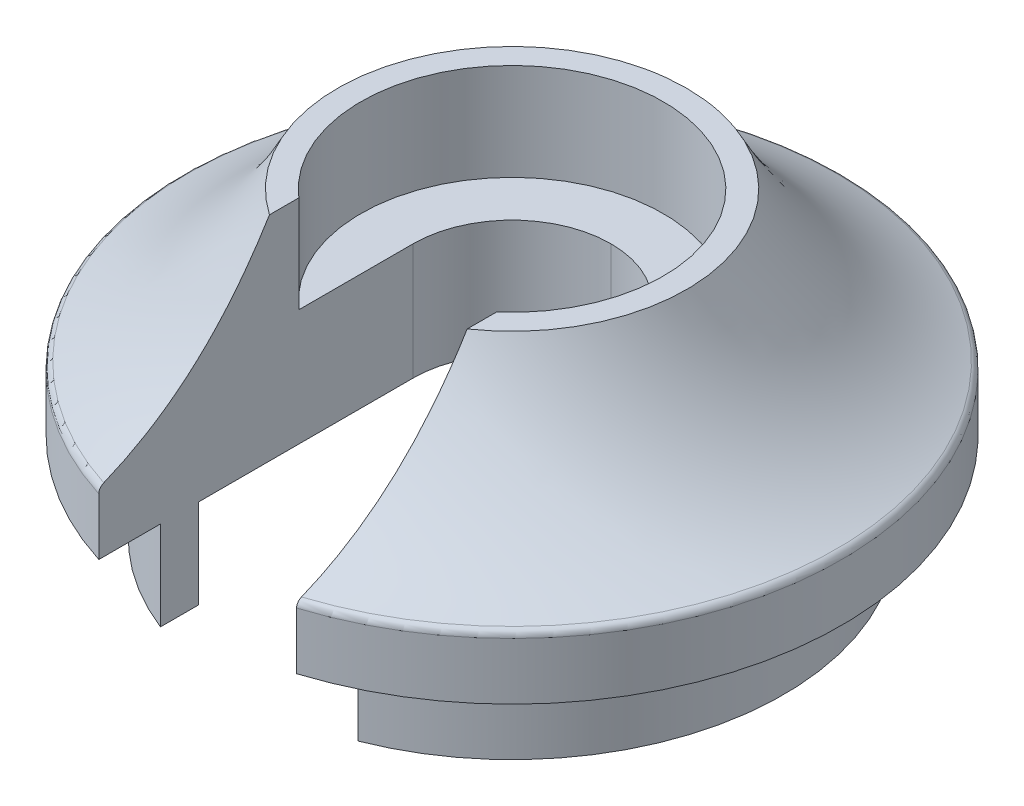
ISO-10303-21;
HEADER;
FILE_DESCRIPTION(('STEP AP214'),'2;1');
FILE_NAME('part.step','',(''),(''),'','','');
FILE_SCHEMA(('AUTOMOTIVE_DESIGN { 1 0 10303 214 1 1 1 1 }'));
ENDSEC;
DATA;
#1=APPLICATION_CONTEXT('core data for automotive mechanical design processes');
#2=APPLICATION_PROTOCOL_DEFINITION('international standard','automotive_design',2000,#1);
#3=PRODUCT_CONTEXT('',#1,'mechanical');
#4=PRODUCT('Part','Part','',(#3));
#5=PRODUCT_RELATED_PRODUCT_CATEGORY('part','',(#4));
#6=PRODUCT_DEFINITION_FORMATION('','',#4);
#7=PRODUCT_DEFINITION_CONTEXT('part definition',#1,'design');
#8=PRODUCT_DEFINITION('design','',#6,#7);
#9=PRODUCT_DEFINITION_SHAPE('','',#8);
#10=(LENGTH_UNIT() NAMED_UNIT(*) SI_UNIT(.MILLI.,.METRE.));
#11=(NAMED_UNIT(*) PLANE_ANGLE_UNIT() SI_UNIT($,.RADIAN.));
#12=(NAMED_UNIT(*) SI_UNIT($,.STERADIAN.) SOLID_ANGLE_UNIT());
#13=UNCERTAINTY_MEASURE_WITH_UNIT(LENGTH_MEASURE(1.E-05),#10,'distance_accuracy_value','');
#14=(GEOMETRIC_REPRESENTATION_CONTEXT(3) GLOBAL_UNCERTAINTY_ASSIGNED_CONTEXT((#13)) GLOBAL_UNIT_ASSIGNED_CONTEXT((#10,
#11,#12)) REPRESENTATION_CONTEXT('',''));
#15=CARTESIAN_POINT('',(0.,0.,0.));
#16=DIRECTION('',(0.,0.,1.));
#17=DIRECTION('',(1.,0.,0.));
#18=AXIS2_PLACEMENT_3D('',#15,#16,#17);
#19=CARTESIAN_POINT('',(0.,10.,0.));
#20=DIRECTION('',(0.,-1.,0.));
#21=DIRECTION('',(0.,0.,-1.));
#22=AXIS2_PLACEMENT_3D('',#19,#20,#21);
#23=CYLINDRICAL_SURFACE('',#22,2.55);
#24=CARTESIAN_POINT('',(0.,5.3,0.));
#25=DIRECTION('',(0.,-1.,0.));
#26=DIRECTION('',(0.,0.,1.));
#27=AXIS2_PLACEMENT_3D('',#24,#25,#26);
#28=CIRCLE('',#27,2.55);
#29=CARTESIAN_POINT('',(0.,5.3,-2.55));
#30=VERTEX_POINT('',#29);
#31=CARTESIAN_POINT('',(2.55,5.3,0.));
#32=VERTEX_POINT('',#31);
#33=EDGE_CURVE('E42',#30,#32,#28,.T.);
#34=ORIENTED_EDGE('',*,*,#33,.F.);
#35=DIRECTION('',(0.,-1.,0.));
#36=VECTOR('',#35,1.);
#37=CARTESIAN_POINT('',(0.,10.,-2.55));
#38=LINE('',#37,#36);
#39=CARTESIAN_POINT('',(0.,2.3,-2.55));
#40=VERTEX_POINT('',#39);
#41=EDGE_CURVE('E11',#30,#40,#38,.T.);
#42=ORIENTED_EDGE('',*,*,#41,.T.);
#43=CARTESIAN_POINT('',(0.,2.3,0.));
#44=DIRECTION('',(0.,-1.,0.));
#45=DIRECTION('',(0.,0.,1.));
#46=AXIS2_PLACEMENT_3D('',#43,#44,#45);
#47=CIRCLE('',#46,2.55);
#48=CARTESIAN_POINT('',(2.55,2.3,0.));
#49=VERTEX_POINT('',#48);
#50=EDGE_CURVE('E28',#40,#49,#47,.T.);
#51=ORIENTED_EDGE('',*,*,#50,.T.);
#52=DIRECTION('',(0.,-1.,0.));
#53=VECTOR('',#52,1.);
#54=CARTESIAN_POINT('',(2.55,10.,0.));
#55=LINE('',#54,#53);
#56=EDGE_CURVE('E371',#32,#49,#55,.T.);
#57=ORIENTED_EDGE('',*,*,#56,.F.);
#58=EDGE_LOOP('',(#34,#42,#51,#57));
#59=FACE_BOUND('',#58,.T.);
#60=ADVANCED_FACE('F17',(#59),#23,.F.);
#61=CARTESIAN_POINT('',(0.,3.76648141199396,0.));
#62=DIRECTION('',(0.,-1.,0.));
#63=DIRECTION('',(0.,0.,-1.));
#64=AXIS2_PLACEMENT_3D('',#61,#62,#63);
#65=TOROIDAL_SURFACE('',#64,8.3,0.2);
#66=CARTESIAN_POINT('',(0.,3.95048873132015,0.));
#67=DIRECTION('',(0.,1.,0.));
#68=DIRECTION('',(0.,0.,1.));
#69=AXIS2_PLACEMENT_3D('',#66,#67,#68);
#70=CIRCLE('',#69,8.37836648795495);
#71=CARTESIAN_POINT('',(0.,3.95048873132015,-8.37836648795495));
#72=VERTEX_POINT('',#71);
#73=CARTESIAN_POINT('',(-2.55,3.9504887313201,7.98088497639757));
#74=VERTEX_POINT('',#73);
#75=EDGE_CURVE('E186',#72,#74,#70,.T.);
#76=ORIENTED_EDGE('',*,*,#75,.F.);
#77=CARTESIAN_POINT('',(0.,3.76648141199396,-8.3));
#78=DIRECTION('',(-1.,0.,0.));
#79=DIRECTION('',(0.,0.,1.));
#80=AXIS2_PLACEMENT_3D('',#77,#78,#79);
#81=CIRCLE('',#80,0.2);
#82=CARTESIAN_POINT('',(0.,3.76648141199396,-8.5));
#83=VERTEX_POINT('',#82);
#84=EDGE_CURVE('E412',#72,#83,#81,.T.);
#85=ORIENTED_EDGE('',*,*,#84,.T.);
#86=CARTESIAN_POINT('',(0.,3.76648141199396,0.));
#87=DIRECTION('',(0.,-1.,0.));
#88=DIRECTION('',(0.,0.,-1.));
#89=AXIS2_PLACEMENT_3D('',#86,#87,#88);
#90=CIRCLE('',#89,8.5);
#91=CARTESIAN_POINT('',(-2.55,3.76648141199271,8.10848321205248));
#92=VERTEX_POINT('',#91);
#93=EDGE_CURVE('E298',#92,#83,#90,.T.);
#94=ORIENTED_EDGE('',*,*,#93,.F.);
#95=CARTESIAN_POINT('',(-2.5499999999976,3.76648141199271,8.10848321204479));
#96=CARTESIAN_POINT('',(-2.55000000730326,3.76864469260102,8.10848323037497));
#97=CARTESIAN_POINT('',(-2.55000162864751,3.77080796463198,8.10844590762757));
#98=CARTESIAN_POINT('',(-2.55000758283459,3.77514967595081,8.10829628774533));
#99=CARTESIAN_POINT('',(-2.55001193780528,3.77732809413225,8.10818337825862));
#100=CARTESIAN_POINT('',(-2.55002286986745,3.78169769982166,8.10788105361864));
#101=CARTESIAN_POINT('',(-2.55002946502801,3.7838888440519,8.10769101383329));
#102=CARTESIAN_POINT('',(-2.55004441618053,3.78828140344149,8.10723299194817));
#103=CARTESIAN_POINT('',(-2.55005278637327,3.7904827522647,8.10696437419797));
#104=CARTESIAN_POINT('',(-2.5500708422647,3.79489311377526,8.10634782558007));
#105=CARTESIAN_POINT('',(-2.55008053839736,3.79710203615184,8.10599924907134));
#106=CARTESIAN_POINT('',(-2.55010082231853,3.8015248325889,8.10522149339372));
#107=CARTESIAN_POINT('',(-2.55011141693237,3.80373859151682,8.1047916597511));
#108=CARTESIAN_POINT('',(-2.55013309622184,3.80816824452674,8.10385018506626));
#109=CARTESIAN_POINT('',(-2.55014418428844,3.81038399785329,8.10333788190323));
#110=CARTESIAN_POINT('',(-2.55016647325908,3.8148147207209,8.1022303551063));
#111=CARTESIAN_POINT('',(-2.55017767432039,3.8170295231386,8.10163446294283));
#112=CARTESIAN_POINT('',(-2.55019983822372,3.82145532489506,8.10035874278918));
#113=CARTESIAN_POINT('',(-2.55021079821264,3.82366613005444,8.09967824114175));
#114=CARTESIAN_POINT('',(-2.55023215700721,3.82808082012186,8.09823239071388));
#115=CARTESIAN_POINT('',(-2.55024255019548,3.83028448316653,8.09746636447176));
#116=CARTESIAN_POINT('',(-2.55026248244525,3.83468167678026,8.09584866389885));
#117=CARTESIAN_POINT('',(-2.55027201339278,3.83687495723661,8.09499630966413));
#118=CARTESIAN_POINT('',(-2.55028996019706,3.84124808160976,8.09320526883457));
#119=CARTESIAN_POINT('',(-2.55029836573181,3.84342764666423,8.09226590129204));
#120=CARTESIAN_POINT('',(-2.55031383470304,3.84776994793238,8.09030027258506));
#121=CARTESIAN_POINT('',(-2.55032088591796,3.84993237610126,8.08927333086099));
#122=CARTESIAN_POINT('',(-2.55033345519132,3.85423692706396,8.08713212184322));
#123=CARTESIAN_POINT('',(-2.55033895945605,3.85637871226742,8.08601717584021));
#124=CARTESIAN_POINT('',(-2.55034828172296,3.86063842094722,8.08369966189236));
#125=CARTESIAN_POINT('',(-2.55035208470464,3.86275597699636,8.08249641857806));
#126=CARTESIAN_POINT('',(-2.55035789125913,3.86696359603276,8.0800021554089));
#127=CARTESIAN_POINT('',(-2.55035987894689,3.86905326153852,8.07871046503804));
#128=CARTESIAN_POINT('',(-2.55036198373361,3.87320139843314,8.0760393010425));
#129=CARTESIAN_POINT('',(-2.55036208446102,3.87525944214445,8.07465916328969));
#130=CARTESIAN_POINT('',(-2.55036038811295,3.87934057037161,8.07181125170537));
#131=CARTESIAN_POINT('',(-2.55035857457218,3.88136319694949,8.07034282168548));
#132=CARTESIAN_POINT('',(-2.55035306842546,3.88536966794423,8.06731863250034));
#133=CARTESIAN_POINT('',(-2.55034935966676,3.88735302417737,8.06576222665228));
#134=CARTESIAN_POINT('',(-2.55034012973902,3.89127708021085,8.06256255821391));
#135=CARTESIAN_POINT('',(-2.55033459314843,3.89321726167683,8.0609186600226));
#136=CARTESIAN_POINT('',(-2.55032182406672,3.89705104962643,8.05754465029803));
#137=CARTESIAN_POINT('',(-2.55031457731504,3.8989441078018,8.05581391582861));
#138=CARTESIAN_POINT('',(-2.55029855617842,3.90267969382078,8.05226705326181));
#139=CARTESIAN_POINT('',(-2.5502897691336,3.9045216436418,8.05045031647914));
#140=CARTESIAN_POINT('',(-2.5502708892948,3.90815102873001,8.04673245039141));
#141=CARTESIAN_POINT('',(-2.55026078588997,3.90993785660355,8.04483072823724));
#142=CARTESIAN_POINT('',(-2.55023955064024,3.91345299307992,8.04094407871478));
#143=CARTESIAN_POINT('',(-2.55022841068922,3.91518066534581,8.03895857591429));
#144=CARTESIAN_POINT('',(-2.55020543682832,3.91857347421187,8.03490574312472));
#145=CARTESIAN_POINT('',(-2.55019359777876,3.92023794604462,8.03283785669256));
#146=CARTESIAN_POINT('',(-2.55016961905669,3.92350033525584,8.0286218295738));
#147=CARTESIAN_POINT('',(-2.55015747767737,3.92509756003479,8.02647315299298));
#148=CARTESIAN_POINT('',(-2.55013334807405,3.92822144357688,8.02209731724631));
#149=CARTESIAN_POINT('',(-2.5501213620458,3.92974738259178,8.01986964427826));
#150=CARTESIAN_POINT('',(-2.55009805892869,3.93272470069336,8.01533778963586));
#151=CARTESIAN_POINT('',(-2.55008674841018,3.93417533365462,8.01303311777425));
#152=CARTESIAN_POINT('',(-2.55006537532866,3.93699807280933,8.00834944436116));
#153=CARTESIAN_POINT('',(-2.55005532418165,3.93836940734758,8.00596997773478));
#154=CARTESIAN_POINT('',(-2.55003711411605,3.94102962506739,8.00113910191081));
#155=CARTESIAN_POINT('',(-2.55002897193544,3.94231771203236,7.99868725422261));
#156=CARTESIAN_POINT('',(-2.55001528781431,3.94480754761605,7.99371421214809));
#157=CARTESIAN_POINT('',(-2.55000976838488,3.94600847637416,7.99119260728232));
#158=CARTESIAN_POINT('',(-2.55000211281541,3.94832021829637,7.98608286254511));
#159=CARTESIAN_POINT('',(-2.55000000549345,3.94943018946667,7.98349434164155));
#160=CARTESIAN_POINT('',(-2.54999999999999,3.9504887313201,7.98088497639757));
#161=B_SPLINE_CURVE_WITH_KNOTS('',3,(#95,#96,#97,#98,#99,#100,#101,#102,#103,#104,#105,#106,
#107,#108,#109,#110,#111,#112,#113,#114,#115,#116,#117,#118,#119,#120,#121,#122,#123,#124,#125,
#126,#127,#128,#129,#130,#131,#132,#133,#134,#135,#136,#137,#138,#139,#140,#141,#142,#143,#144,
#145,#146,#147,#148,#149,#150,#151,#152,#153,#154,#155,#156,#157,#158,#159,#160),.UNSPECIFIED.,
.F.,.F.,(4,2,2,2,2,2,2,2,2,2,2,2,2,2,2,2,2,2,2,2,2,2,2,2,2,2,2,2,2,2,2,2,4),(0.,
0.00648950798332805,0.0130322361696587,0.0196290422504767,0.0262807624634979,0.032988211700674,
0.0397521836298338,0.0465734508292739,0.0534527649347166,0.0603908567981627,0.0673884366582495,
0.0744461943218448,0.0815647993566676,0.0887449012948437,0.0959871298473562,0.103292095129443,
0.110660387897061,0.118092579794568,0.125589223613888,0.133150853565391,0.140777985560837,
0.148471117508704,0.156230729622274,0.164057284740869,0.17195122866462,0.179912990503167,
0.187942983038674,0.196041603103526,0.204209231973076,0.212446235773759,0.220752965906833,
0.229129759488037,0.237576939803324),.UNSPECIFIED.);
#162=EDGE_CURVE('E271',#92,#74,#161,.T.);
#163=ORIENTED_EDGE('',*,*,#162,.T.);
#164=EDGE_LOOP('',(#76,#85,#94,#163));
#165=FACE_BOUND('',#164,.T.);
#166=ADVANCED_FACE('F219',(#165),#65,.T.);
#167=CARTESIAN_POINT('',(0.,3.9,0.));
#168=DIRECTION('',(0.,-1.,0.));
#169=DIRECTION('',(0.,0.,-1.));
#170=AXIS2_PLACEMENT_3D('',#167,#168,#169);
#171=CYLINDRICAL_SURFACE('',#170,8.5);
#172=ORIENTED_EDGE('',*,*,#93,.T.);
#173=DIRECTION('',(0.,-1.,0.));
#174=VECTOR('',#173,1.);
#175=CARTESIAN_POINT('',(0.,3.9,-8.5));
#176=LINE('',#175,#174);
#177=CARTESIAN_POINT('',(0.,2.3,-8.5));
#178=VERTEX_POINT('',#177);
#179=EDGE_CURVE('E302',#83,#178,#176,.T.);
#180=ORIENTED_EDGE('',*,*,#179,.T.);
#181=CARTESIAN_POINT('',(0.,2.3,0.));
#182=DIRECTION('',(0.,1.,0.));
#183=DIRECTION('',(0.,0.,1.));
#184=AXIS2_PLACEMENT_3D('',#181,#182,#183);
#185=CIRCLE('',#184,8.5);
#186=CARTESIAN_POINT('',(-2.55,2.3,8.10848321204404));
#187=VERTEX_POINT('',#186);
#188=EDGE_CURVE('E397',#178,#187,#185,.T.);
#189=ORIENTED_EDGE('',*,*,#188,.T.);
#190=DIRECTION('',(0.,-1.,0.));
#191=VECTOR('',#190,1.);
#192=CARTESIAN_POINT('',(-2.55,3.9,8.10848321204404));
#193=LINE('',#192,#191);
#194=EDGE_CURVE('E291',#92,#187,#193,.T.);
#195=ORIENTED_EDGE('',*,*,#194,.F.);
#196=EDGE_LOOP('',(#172,#180,#189,#195));
#197=FACE_BOUND('',#196,.T.);
#198=ADVANCED_FACE('F224',(#197),#171,.T.);
#199=CARTESIAN_POINT('',(0.,2.3,0.));
#200=DIRECTION('',(0.,-1.,0.));
#201=DIRECTION('',(0.,0.,-1.));
#202=AXIS2_PLACEMENT_3D('',#199,#200,#201);
#203=CYLINDRICAL_SURFACE('',#202,6.1);
#204=CARTESIAN_POINT('',(0.,2.3,0.));
#205=DIRECTION('',(0.,1.,0.));
#206=DIRECTION('',(0.,0.,1.));
#207=AXIS2_PLACEMENT_3D('',#204,#205,#206);
#208=CIRCLE('',#207,6.1);
#209=CARTESIAN_POINT('',(2.55,2.3,5.54143483224336));
#210=VERTEX_POINT('',#209);
#211=CARTESIAN_POINT('',(0.,2.3,-6.1));
#212=VERTEX_POINT('',#211);
#213=EDGE_CURVE('E393',#210,#212,#208,.T.);
#214=ORIENTED_EDGE('',*,*,#213,.T.);
#215=DIRECTION('',(0.,-1.,0.));
#216=VECTOR('',#215,1.);
#217=CARTESIAN_POINT('',(0.,2.3,-6.1));
#218=LINE('',#217,#216);
#219=CARTESIAN_POINT('',(0.,0.,-6.1));
#220=VERTEX_POINT('',#219);
#221=EDGE_CURVE('E398',#212,#220,#218,.T.);
#222=ORIENTED_EDGE('',*,*,#221,.T.);
#223=CARTESIAN_POINT('',(0.,0.,0.));
#224=DIRECTION('',(0.,1.,0.));
#225=DIRECTION('',(0.,0.,1.));
#226=AXIS2_PLACEMENT_3D('',#223,#224,#225);
#227=CIRCLE('',#226,6.1);
#228=CARTESIAN_POINT('',(2.55,0.,5.54143483224336));
#229=VERTEX_POINT('',#228);
#230=EDGE_CURVE('E375',#229,#220,#227,.T.);
#231=ORIENTED_EDGE('',*,*,#230,.F.);
#232=DIRECTION('',(0.,1.,0.));
#233=VECTOR('',#232,1.);
#234=CARTESIAN_POINT('',(2.55,2.3,5.54143483224336));
#235=LINE('',#234,#233);
#236=EDGE_CURVE('E391',#229,#210,#235,.T.);
#237=ORIENTED_EDGE('',*,*,#236,.T.);
#238=EDGE_LOOP('',(#214,#222,#231,#237));
#239=FACE_BOUND('',#238,.T.);
#240=ADVANCED_FACE('F236',(#239),#203,.F.);
#241=CARTESIAN_POINT('',(0.,2.3,0.));
#242=DIRECTION('',(0.,-1.,0.));
#243=DIRECTION('',(0.,0.,-1.));
#244=AXIS2_PLACEMENT_3D('',#241,#242,#243);
#245=CYLINDRICAL_SURFACE('',#244,7.);
#246=CARTESIAN_POINT('',(0.,2.3,0.));
#247=DIRECTION('',(0.,1.,0.));
#248=DIRECTION('',(0.,0.,1.));
#249=AXIS2_PLACEMENT_3D('',#246,#247,#248);
#250=CIRCLE('',#249,7.);
#251=CARTESIAN_POINT('',(0.,2.3,-7.));
#252=VERTEX_POINT('',#251);
#253=CARTESIAN_POINT('',(-2.55,2.3,6.51901066113563));
#254=VERTEX_POINT('',#253);
#255=EDGE_CURVE('E185',#252,#254,#250,.T.);
#256=ORIENTED_EDGE('',*,*,#255,.F.);
#257=DIRECTION('',(0.,-1.,0.));
#258=VECTOR('',#257,1.);
#259=CARTESIAN_POINT('',(0.,2.3,-7.));
#260=LINE('',#259,#258);
#261=CARTESIAN_POINT('',(0.,0.,-7.));
#262=VERTEX_POINT('',#261);
#263=EDGE_CURVE('E387',#252,#262,#260,.T.);
#264=ORIENTED_EDGE('',*,*,#263,.T.);
#265=CARTESIAN_POINT('',(0.,0.,0.));
#266=DIRECTION('',(0.,1.,0.));
#267=DIRECTION('',(0.,0.,1.));
#268=AXIS2_PLACEMENT_3D('',#265,#266,#267);
#269=CIRCLE('',#268,7.);
#270=CARTESIAN_POINT('',(-2.55,0.,6.51901066113563));
#271=VERTEX_POINT('',#270);
#272=EDGE_CURVE('E392',#262,#271,#269,.T.);
#273=ORIENTED_EDGE('',*,*,#272,.T.);
#274=DIRECTION('',(0.,-1.,0.));
#275=VECTOR('',#274,1.);
#276=CARTESIAN_POINT('',(-2.55,2.3,6.51901066113563));
#277=LINE('',#276,#275);
#278=EDGE_CURVE('E447',#254,#271,#277,.T.);
#279=ORIENTED_EDGE('',*,*,#278,.F.);
#280=EDGE_LOOP('',(#256,#264,#273,#279));
#281=FACE_BOUND('',#280,.T.);
#282=ADVANCED_FACE('F327',(#281),#245,.T.);
#283=CARTESIAN_POINT('',(0.,0.,0.));
#284=DIRECTION('',(0.,1.,0.));
#285=DIRECTION('',(1.,0.,0.));
#286=AXIS2_PLACEMENT_3D('',#283,#284,#285);
#287=PLANE('',#286);
#288=DIRECTION('',(0.,0.,1.));
#289=VECTOR('',#288,1.);
#290=CARTESIAN_POINT('',(-2.55,0.,0.));
#291=LINE('',#290,#289);
#292=CARTESIAN_POINT('',(-2.55,0.,5.54143483224336));
#293=VERTEX_POINT('',#292);
#294=EDGE_CURVE('E462',#293,#271,#291,.T.);
#295=ORIENTED_EDGE('',*,*,#294,.T.);
#296=ORIENTED_EDGE('',*,*,#272,.F.);
#297=CARTESIAN_POINT('',(0.,0.,0.));
#298=DIRECTION('',(0.,1.,0.));
#299=DIRECTION('',(0.,0.,1.));
#300=AXIS2_PLACEMENT_3D('',#297,#298,#299);
#301=CIRCLE('',#300,7.);
#302=CARTESIAN_POINT('',(2.55,0.,6.51901066113563));
#303=VERTEX_POINT('',#302);
#304=EDGE_CURVE('E376',#303,#262,#301,.T.);
#305=ORIENTED_EDGE('',*,*,#304,.F.);
#306=DIRECTION('',(0.,0.,-1.));
#307=VECTOR('',#306,1.);
#308=CARTESIAN_POINT('',(2.55,0.,11.3377187851519));
#309=LINE('',#308,#307);
#310=EDGE_CURVE('E463',#303,#229,#309,.T.);
#311=ORIENTED_EDGE('',*,*,#310,.T.);
#312=ORIENTED_EDGE('',*,*,#230,.T.);
#313=CARTESIAN_POINT('',(0.,0.,0.));
#314=DIRECTION('',(0.,1.,0.));
#315=DIRECTION('',(0.,0.,1.));
#316=AXIS2_PLACEMENT_3D('',#313,#314,#315);
#317=CIRCLE('',#316,6.1);
#318=EDGE_CURVE('E372',#220,#293,#317,.T.);
#319=ORIENTED_EDGE('',*,*,#318,.T.);
#320=EDGE_LOOP('',(#295,#296,#305,#311,#312,#319));
#321=FACE_BOUND('',#320,.T.);
#322=ADVANCED_FACE('F324',(#321),#287,.F.);
#323=CARTESIAN_POINT('',(0.,2.3,0.));
#324=DIRECTION('',(0.,-1.,0.));
#325=DIRECTION('',(0.,0.,-1.));
#326=AXIS2_PLACEMENT_3D('',#323,#324,#325);
#327=CYLINDRICAL_SURFACE('',#326,7.);
#328=ORIENTED_EDGE('',*,*,#263,.F.);
#329=CARTESIAN_POINT('',(0.,2.3,0.));
#330=DIRECTION('',(0.,1.,0.));
#331=DIRECTION('',(0.,0.,1.));
#332=AXIS2_PLACEMENT_3D('',#329,#330,#331);
#333=CIRCLE('',#332,7.);
#334=CARTESIAN_POINT('',(2.55,2.3,6.51901066113563));
#335=VERTEX_POINT('',#334);
#336=EDGE_CURVE('E386',#335,#252,#333,.T.);
#337=ORIENTED_EDGE('',*,*,#336,.F.);
#338=DIRECTION('',(0.,1.,0.));
#339=VECTOR('',#338,1.);
#340=CARTESIAN_POINT('',(2.55,2.3,6.51901066113563));
#341=LINE('',#340,#339);
#342=EDGE_CURVE('E451',#303,#335,#341,.T.);
#343=ORIENTED_EDGE('',*,*,#342,.F.);
#344=ORIENTED_EDGE('',*,*,#304,.T.);
#345=EDGE_LOOP('',(#328,#337,#343,#344));
#346=FACE_BOUND('',#345,.T.);
#347=ADVANCED_FACE('F323',(#346),#327,.T.);
#348=CARTESIAN_POINT('',(0.,2.3,0.));
#349=DIRECTION('',(0.,-1.,0.));
#350=DIRECTION('',(0.,0.,-1.));
#351=AXIS2_PLACEMENT_3D('',#348,#349,#350);
#352=CYLINDRICAL_SURFACE('',#351,6.1);
#353=ORIENTED_EDGE('',*,*,#221,.F.);
#354=CARTESIAN_POINT('',(0.,2.3,0.));
#355=DIRECTION('',(0.,1.,0.));
#356=DIRECTION('',(0.,0.,1.));
#357=AXIS2_PLACEMENT_3D('',#354,#355,#356);
#358=CIRCLE('',#357,6.1);
#359=CARTESIAN_POINT('',(-2.55,2.3,5.54143483224336));
#360=VERTEX_POINT('',#359);
#361=EDGE_CURVE('E354',#212,#360,#358,.T.);
#362=ORIENTED_EDGE('',*,*,#361,.T.);
#363=DIRECTION('',(0.,-1.,0.));
#364=VECTOR('',#363,1.);
#365=CARTESIAN_POINT('',(-2.55,2.3,5.54143483224336));
#366=LINE('',#365,#364);
#367=EDGE_CURVE('E402',#360,#293,#366,.T.);
#368=ORIENTED_EDGE('',*,*,#367,.T.);
#369=ORIENTED_EDGE('',*,*,#318,.F.);
#370=EDGE_LOOP('',(#353,#362,#368,#369));
#371=FACE_BOUND('',#370,.T.);
#372=ADVANCED_FACE('F339',(#371),#352,.F.);
#373=CARTESIAN_POINT('',(0.,2.3,0.));
#374=DIRECTION('',(0.,1.,0.));
#375=DIRECTION('',(1.,0.,0.));
#376=AXIS2_PLACEMENT_3D('',#373,#374,#375);
#377=PLANE('',#376);
#378=DIRECTION('',(0.,0.,-1.));
#379=VECTOR('',#378,1.);
#380=CARTESIAN_POINT('',(-2.55,2.3,0.));
#381=LINE('',#380,#379);
#382=CARTESIAN_POINT('',(-2.55,2.3,0.));
#383=VERTEX_POINT('',#382);
#384=EDGE_CURVE('E350',#360,#383,#381,.T.);
#385=ORIENTED_EDGE('',*,*,#384,.F.);
#386=ORIENTED_EDGE('',*,*,#361,.F.);
#387=ORIENTED_EDGE('',*,*,#213,.F.);
#388=DIRECTION('',(0.,0.,1.));
#389=VECTOR('',#388,1.);
#390=CARTESIAN_POINT('',(2.55,2.3,0.));
#391=LINE('',#390,#389);
#392=EDGE_CURVE('E467',#49,#210,#391,.T.);
#393=ORIENTED_EDGE('',*,*,#392,.F.);
#394=ORIENTED_EDGE('',*,*,#50,.F.);
#395=CARTESIAN_POINT('',(0.,2.3,0.));
#396=DIRECTION('',(0.,-1.,0.));
#397=DIRECTION('',(0.,0.,1.));
#398=AXIS2_PLACEMENT_3D('',#395,#396,#397);
#399=CIRCLE('',#398,2.55);
#400=EDGE_CURVE('E356',#383,#40,#399,.T.);
#401=ORIENTED_EDGE('',*,*,#400,.F.);
#402=EDGE_LOOP('',(#385,#386,#387,#393,#394,#401));
#403=FACE_BOUND('',#402,.T.);
#404=ADVANCED_FACE('F337',(#403),#377,.F.);
#405=CARTESIAN_POINT('',(0.,3.9,0.));
#406=DIRECTION('',(0.,-1.,0.));
#407=DIRECTION('',(0.,0.,-1.));
#408=AXIS2_PLACEMENT_3D('',#405,#406,#407);
#409=CYLINDRICAL_SURFACE('',#408,8.5);
#410=ORIENTED_EDGE('',*,*,#179,.F.);
#411=CARTESIAN_POINT('',(0.,3.76648141199396,0.));
#412=DIRECTION('',(0.,-1.,0.));
#413=DIRECTION('',(0.,0.,-1.));
#414=AXIS2_PLACEMENT_3D('',#411,#412,#413);
#415=CIRCLE('',#414,8.5);
#416=CARTESIAN_POINT('',(2.55,3.76648141199396,8.10848321204404));
#417=VERTEX_POINT('',#416);
#418=EDGE_CURVE('E385',#83,#417,#415,.T.);
#419=ORIENTED_EDGE('',*,*,#418,.T.);
#420=DIRECTION('',(0.,1.,0.));
#421=VECTOR('',#420,1.);
#422=CARTESIAN_POINT('',(2.55,3.9,8.10848321204404));
#423=LINE('',#422,#421);
#424=CARTESIAN_POINT('',(2.55,2.3,8.10848321204404));
#425=VERTEX_POINT('',#424);
#426=EDGE_CURVE('E370',#425,#417,#423,.T.);
#427=ORIENTED_EDGE('',*,*,#426,.F.);
#428=CARTESIAN_POINT('',(0.,2.3,0.));
#429=DIRECTION('',(0.,1.,0.));
#430=DIRECTION('',(0.,0.,1.));
#431=AXIS2_PLACEMENT_3D('',#428,#429,#430);
#432=CIRCLE('',#431,8.5);
#433=EDGE_CURVE('E381',#425,#178,#432,.T.);
#434=ORIENTED_EDGE('',*,*,#433,.T.);
#435=EDGE_LOOP('',(#410,#419,#427,#434));
#436=FACE_BOUND('',#435,.T.);
#437=ADVANCED_FACE('F19',(#436),#409,.T.);
#438=CARTESIAN_POINT('',(0.,2.3,0.));
#439=DIRECTION('',(0.,1.,0.));
#440=DIRECTION('',(1.,0.,0.));
#441=AXIS2_PLACEMENT_3D('',#438,#439,#440);
#442=PLANE('',#441);
#443=DIRECTION('',(0.,0.,-1.));
#444=VECTOR('',#443,1.);
#445=CARTESIAN_POINT('',(-2.55,2.3,0.));
#446=LINE('',#445,#444);
#447=EDGE_CURVE('E295',#187,#254,#446,.T.);
#448=ORIENTED_EDGE('',*,*,#447,.F.);
#449=ORIENTED_EDGE('',*,*,#188,.F.);
#450=ORIENTED_EDGE('',*,*,#433,.F.);
#451=DIRECTION('',(0.,0.,1.));
#452=VECTOR('',#451,1.);
#453=CARTESIAN_POINT('',(2.55,2.3,0.));
#454=LINE('',#453,#452);
#455=EDGE_CURVE('E455',#335,#425,#454,.T.);
#456=ORIENTED_EDGE('',*,*,#455,.F.);
#457=ORIENTED_EDGE('',*,*,#336,.T.);
#458=ORIENTED_EDGE('',*,*,#255,.T.);
#459=EDGE_LOOP('',(#448,#449,#450,#456,#457,#458));
#460=FACE_BOUND('',#459,.T.);
#461=ADVANCED_FACE('F235',(#460),#442,.F.);
#462=CARTESIAN_POINT('',(1.22314586074443,7.8,4.33057896860729));
#463=CARTESIAN_POINT('',(7.95510922584044,7.8,2.42917659622463));
#464=CARTESIAN_POINT('',(6.99533142393533,7.8,-4.50000000000002));
#465=CARTESIAN_POINT('',(0.,7.8,-4.5));
#466=CARTESIAN_POINT('',(-6.99533142393534,7.8,-4.49999999999998));
#467=CARTESIAN_POINT('',(-7.95510922584042,7.8,2.42917659622466));
#468=CARTESIAN_POINT('',(-1.22314586074441,7.8,4.3305789686073));
#469=CARTESIAN_POINT('',(1.60470222218137,5.00439351653812,5.68148895179723));
#470=CARTESIAN_POINT('',(10.4366795997922,5.00439351653812,3.18695031160074));
#471=CARTESIAN_POINT('',(9.17750224331555,5.00439351653812,-5.90376032129253));
#472=CARTESIAN_POINT('',(0.,5.00439351653812,-5.9037603212925));
#473=CARTESIAN_POINT('',(-9.17750224331557,5.00439351653812,-5.90376032129249));
#474=CARTESIAN_POINT('',(-10.4366795997921,5.00439351653812,3.18695031160079));
#475=CARTESIAN_POINT('',(-1.60470222218134,5.00439351653812,5.68148895179723));
#476=CARTESIAN_POINT('',(2.27732539767599,3.95048873132015,8.06292837867152));
#477=CARTESIAN_POINT('',(14.8112934546228,3.95048873132015,4.52278484158509));
#478=CARTESIAN_POINT('',(13.0243223054307,3.95048873132015,-8.37836648795498));
#479=CARTESIAN_POINT('',(0.,3.95048873132015,-8.37836648795495));
#480=CARTESIAN_POINT('',(-13.0243223054307,3.95048873132015,-8.37836648795491));
#481=CARTESIAN_POINT('',(-14.8112934546228,3.95048873132014,4.52278484158516));
#482=CARTESIAN_POINT('',(-2.27732539767595,3.95048873132014,8.06292837867153));
#483=(BOUNDED_SURFACE() B_SPLINE_SURFACE(2,3,((#462,#463,#464,#465,#466,#467,#468),(#469,#470,
#471,#472,#473,#474,#475),(#476,#477,#478,#479,#480,#481,#482)),.UNSPECIFIED.,.F.,.F.,
.F.) B_SPLINE_SURFACE_WITH_KNOTS((3,3),(4,3,4),(0.,0.853327571810689),(0.,0.5,1.),
.UNSPECIFIED.) GEOMETRIC_REPRESENTATION_ITEM() RATIONAL_B_SPLINE_SURFACE(((1.,0.424801746930923,
0.424801746930923,1.,0.424801746930923,0.424801746930923,1.),(1.,0.424801746930923,
0.424801746930923,1.,0.424801746930923,0.424801746930923,1.),(1.,0.424801746930923,
0.424801746930923,1.,0.424801746930923,0.424801746930923,1.))) REPRESENTATION_ITEM('') SURFACE());
#484=CARTESIAN_POINT('',(0.,3.95048873132015,0.));
#485=DIRECTION('',(0.,1.,0.));
#486=DIRECTION('',(0.,0.,1.));
#487=AXIS2_PLACEMENT_3D('',#484,#485,#486);
#488=CIRCLE('',#487,8.37836648795495);
#489=CARTESIAN_POINT('',(2.55,3.95048873132015,7.98088497639745));
#490=VERTEX_POINT('',#489);
#491=EDGE_CURVE('E183',#490,#72,#488,.T.);
#492=CARTESIAN_POINT('',(-2.55000000000001,3.95048873132014,7.98088497639745));
#493=CARTESIAN_POINT('',(-2.5500006167357,3.99804024097785,7.8636429286815));
#494=CARTESIAN_POINT('',(-2.55001017789206,4.04841020129753,7.74754201810113));
#495=CARTESIAN_POINT('',(-2.55003630036181,4.15391539230899,7.51959277859792));
#496=CARTESIAN_POINT('',(-2.55005275686954,4.20896982865084,7.40770704378399));
#497=CARTESIAN_POINT('',(-2.55008223819433,4.32365940043246,7.18807070815166));
#498=CARTESIAN_POINT('',(-2.55009530302528,4.3832292871694,7.08028603914383));
#499=CARTESIAN_POINT('',(-2.55011278953167,4.50675295418504,6.86872842235609));
#500=CARTESIAN_POINT('',(-2.55011729781931,4.57065594721561,6.764925809836));
#501=CARTESIAN_POINT('',(-2.55011623309044,4.70265657773249,6.5612092210369));
#502=CARTESIAN_POINT('',(-2.55011074094827,4.77071630100335,6.46127066525032));
#503=CARTESIAN_POINT('',(-2.55009184365701,4.91084386255172,6.26515803158373));
#504=CARTESIAN_POINT('',(-2.55007848655594,4.98288497673179,6.16896484515817));
#505=CARTESIAN_POINT('',(-2.55004980676015,5.1307927733706,5.98021821924956));
#506=CARTESIAN_POINT('',(-2.55003449252962,5.20664217499547,5.88765122635931));
#507=CARTESIAN_POINT('',(-2.55000920279794,5.36198837073783,5.70603207313181));
#508=CARTESIAN_POINT('',(-2.54999921409905,5.44147561314671,5.61697173522052));
#509=CARTESIAN_POINT('',(-2.55000077197135,5.60255925846221,5.44370434499106));
#510=CARTESIAN_POINT('',(-2.55001193998204,5.68409330678892,5.35943924988984));
#511=CARTESIAN_POINT('',(-2.55004304071185,5.85106133983196,5.19337424538445));
#512=CARTESIAN_POINT('',(-2.5500630494884,5.93652327035114,5.11160245969857));
#513=CARTESIAN_POINT('',(-2.55009911454969,6.1112940079741,4.95047205815008));
#514=CARTESIAN_POINT('',(-2.55011512885278,6.20063296048053,4.87114617586528));
#515=CARTESIAN_POINT('',(-2.55013698306756,6.38310563503449,4.71485320433244));
#516=CARTESIAN_POINT('',(-2.55014270594659,6.47627083318132,4.63792290533527));
#517=CARTESIAN_POINT('',(-2.55014196916265,6.66634489683893,4.48636501873632));
#518=CARTESIAN_POINT('',(-2.55013535796179,6.76328581147899,4.4117776750757));
#519=CARTESIAN_POINT('',(-2.55011257177546,6.96086149132278,4.26484717664213));
#520=CARTESIAN_POINT('',(-2.55009627072424,7.06152824123857,4.19254707994182));
#521=CARTESIAN_POINT('',(-2.55006073539124,7.26650516551427,4.05013064387258));
#522=CARTESIAN_POINT('',(-2.55004146294971,7.37084671224228,3.98005954121954));
#523=CARTESIAN_POINT('',(-2.55001126444541,7.583128922672,3.84203518401196));
#524=CARTESIAN_POINT('',(-2.55000046624325,7.69110000477226,3.77412867500026));
#525=CARTESIAN_POINT('',(-2.55000000000001,7.8,3.70776212829248));
#526=B_SPLINE_CURVE_WITH_KNOTS('',3,(#492,#493,#494,#495,#496,#497,#498,#499,#500,#501,#502,
#503,#504,#505,#506,#507,#508,#509,#510,#511,#512,#513,#514,#515,#516,#517,#518,#519,#520,#521,
#522,#523,#524,#525),.UNSPECIFIED.,.F.,.F.,(4,2,2,2,2,2,2,2,2,2,2,2,2,2,2,2,4),(0.,
0.379520592076948,0.75347071331235,1.12278493077338,1.48834046380681,1.85095283714147,
2.21137261805467,2.57028330271385,2.92830035082373,3.27997178248017,3.63472942062689,
3.99307177091692,4.35546397389627,4.72233791421263,5.09409271863829,5.47109558122605,
5.8536828532207),.UNSPECIFIED.);
#527=CARTESIAN_POINT('',(-2.55,7.8,3.70776212829248));
#528=VERTEX_POINT('',#527);
#529=EDGE_CURVE('E139',#74,#528,#526,.T.);
#530=CARTESIAN_POINT('',(0.,7.8,0.));
#531=DIRECTION('',(0.,1.,0.));
#532=DIRECTION('',(0.,0.,1.));
#533=AXIS2_PLACEMENT_3D('',#530,#531,#532);
#534=CIRCLE('',#533,4.5);
#535=CARTESIAN_POINT('',(2.55,7.8,3.70776212829248));
#536=VERTEX_POINT('',#535);
#537=EDGE_CURVE('E131',#536,#528,#534,.T.);
#538=CARTESIAN_POINT('',(2.55000000000001,7.8,3.70776212829248));
#539=CARTESIAN_POINT('',(2.55000046836938,7.69079856043925,3.77431238569133));
#540=CARTESIAN_POINT('',(2.55001144621256,7.58253110455896,3.842411107414));
#541=CARTESIAN_POINT('',(2.55004218902105,7.36967350914647,3.98083461894369));
#542=CARTESIAN_POINT('',(2.55006182331294,7.26505275674402,4.05111237307743));
#543=CARTESIAN_POINT('',(2.55009810214169,7.0595355522399,4.19395761328466));
#544=CARTESIAN_POINT('',(2.55011478450338,6.9586075259102,4.26647958811957));
#545=CARTESIAN_POINT('',(2.55013822455608,6.76052825584197,4.41387003976495));
#546=CARTESIAN_POINT('',(2.5501451096708,6.6633448239608,4.48869520947416));
#547=CARTESIAN_POINT('',(2.55014619658081,6.47280550208008,4.64074560762879));
#548=CARTESIAN_POINT('',(2.55014055220683,6.37941736701379,4.71793037819266));
#549=CARTESIAN_POINT('',(2.5501186037722,6.19651940726152,4.87474978259803));
#550=CARTESIAN_POINT('',(2.55010241939247,6.10697792908032,4.95434745681745));
#551=CARTESIAN_POINT('',(2.55006578125349,5.93182353981668,5.11603950950221));
#552=CARTESIAN_POINT('',(2.55004537171943,5.84618033775405,5.19810103861049));
#553=CARTESIAN_POINT('',(2.55001320690037,5.67887194213224,5.36476422725163));
#554=CARTESIAN_POINT('',(2.55000137814269,5.59717870460427,5.44933770755342));
#555=CARTESIAN_POINT('',(2.54999860500724,5.43626472308466,5.62274380234421));
#556=CARTESIAN_POINT('',(2.55000791774467,5.35708642199953,5.71161584889876));
#557=CARTESIAN_POINT('',(2.55003211209324,5.20233763408851,5.89284273314299));
#558=CARTESIAN_POINT('',(2.55004700784474,5.12677686225564,5.98520587421799));
#559=CARTESIAN_POINT('',(2.55007507192687,4.97942492521438,6.17352837731228));
#560=CARTESIAN_POINT('',(2.55008823264456,4.90765115124088,6.26950135852312));
#561=CARTESIAN_POINT('',(2.55010698895868,4.76803587860961,6.46515647039599));
#562=CARTESIAN_POINT('',(2.55011253775438,4.70022113949063,6.56485770948195));
#563=CARTESIAN_POINT('',(2.55011392686198,4.56868711923944,6.76808187068528));
#564=CARTESIAN_POINT('',(2.55010968773929,4.50500568967678,6.87162930408516));
#565=CARTESIAN_POINT('',(2.55009287022999,4.38190084010557,7.08265810018164));
#566=CARTESIAN_POINT('',(2.5500802064135,4.32252802356751,7.19016899377215));
#567=CARTESIAN_POINT('',(2.55005152801083,4.20820729904114,7.40923863460131));
#568=CARTESIAN_POINT('',(2.55003547334751,4.15332431316099,7.52083125786369));
#569=CARTESIAN_POINT('',(2.55000996348657,4.04813591246285,7.74817450134191));
#570=CARTESIAN_POINT('',(2.5500006100933,3.99791080730528,7.86396229019772));
#571=CARTESIAN_POINT('',(2.55000000000004,3.95048873132015,7.98088497639745));
#572=B_SPLINE_CURVE_WITH_KNOTS('',3,(#538,#539,#540,#541,#542,#543,#544,#545,#546,#547,#548,
#549,#550,#551,#552,#553,#554,#555,#556,#557,#558,#559,#560,#561,#562,#563,#564,#565,#566,#567,
#568,#569,#570,#571),.UNSPECIFIED.,.F.,.F.,(4,2,2,2,2,2,2,2,2,2,2,2,2,2,2,2,4),(0.,
0.383646346309832,0.761689712366491,1.13446887177638,1.50235388222271,1.86574719759513,
2.22508451021568,2.58083525926988,2.93350274226673,3.29048218229899,3.64837193856834,
4.00778317977494,4.36939444886048,4.73395070550515,5.10226123766611,5.47519644158341,
5.85368353432607),.UNSPECIFIED.);
#573=EDGE_CURVE('E135',#536,#490,#572,.T.);
#574=ORIENTED_EDGE('',*,*,#491,.T.);
#575=ORIENTED_EDGE('',*,*,#75,.T.);
#576=ORIENTED_EDGE('',*,*,#529,.T.);
#577=ORIENTED_EDGE('',*,*,#537,.F.);
#578=ORIENTED_EDGE('',*,*,#573,.T.);
#579=EDGE_LOOP('',(#574,#575,#576,#577,#578));
#580=FACE_BOUND('',#579,.T.);
#581=ADVANCED_FACE('F134',(#580),#483,.T.);
#582=CARTESIAN_POINT('',(0.,5.3,0.));
#583=DIRECTION('',(0.,1.,0.));
#584=DIRECTION('',(1.,0.,0.));
#585=AXIS2_PLACEMENT_3D('',#582,#583,#584);
#586=PLANE('',#585);
#587=CARTESIAN_POINT('',(0.,5.3,0.));
#588=DIRECTION('',(0.,1.,0.));
#589=DIRECTION('',(0.,0.,1.));
#590=AXIS2_PLACEMENT_3D('',#587,#588,#589);
#591=CIRCLE('',#590,3.9);
#592=CARTESIAN_POINT('',(2.55,5.3,2.9508473359359));
#593=VERTEX_POINT('',#592);
#594=CARTESIAN_POINT('',(-2.55,5.3,2.9508473359359));
#595=VERTEX_POINT('',#594);
#596=EDGE_CURVE('E161',#593,#595,#591,.T.);
#597=ORIENTED_EDGE('',*,*,#596,.T.);
#598=DIRECTION('',(0.,0.,-1.));
#599=VECTOR('',#598,1.);
#600=CARTESIAN_POINT('',(-2.55,5.3,0.));
#601=LINE('',#600,#599);
#602=CARTESIAN_POINT('',(-2.55,5.3,0.));
#603=VERTEX_POINT('',#602);
#604=EDGE_CURVE('E406',#595,#603,#601,.T.);
#605=ORIENTED_EDGE('',*,*,#604,.T.);
#606=CARTESIAN_POINT('',(0.,5.3,0.));
#607=DIRECTION('',(0.,-1.,0.));
#608=DIRECTION('',(0.,0.,1.));
#609=AXIS2_PLACEMENT_3D('',#606,#607,#608);
#610=CIRCLE('',#609,2.55);
#611=EDGE_CURVE('E379',#603,#30,#610,.T.);
#612=ORIENTED_EDGE('',*,*,#611,.T.);
#613=ORIENTED_EDGE('',*,*,#33,.T.);
#614=DIRECTION('',(0.,0.,1.));
#615=VECTOR('',#614,1.);
#616=CARTESIAN_POINT('',(2.55,5.3,0.));
#617=LINE('',#616,#615);
#618=EDGE_CURVE('E380',#32,#593,#617,.T.);
#619=ORIENTED_EDGE('',*,*,#618,.T.);
#620=EDGE_LOOP('',(#597,#605,#612,#613,#619));
#621=FACE_BOUND('',#620,.T.);
#622=ADVANCED_FACE('F215',(#621),#586,.T.);
#623=CARTESIAN_POINT('',(0.,5.3,0.));
#624=DIRECTION('',(0.,1.,0.));
#625=DIRECTION('',(0.,0.,1.));
#626=AXIS2_PLACEMENT_3D('',#623,#624,#625);
#627=CYLINDRICAL_SURFACE('',#626,3.9);
#628=DIRECTION('',(0.,1.,0.));
#629=VECTOR('',#628,1.);
#630=CARTESIAN_POINT('',(-2.55,5.3,2.9508473359359));
#631=LINE('',#630,#629);
#632=CARTESIAN_POINT('',(-2.55,7.8,2.9508473359359));
#633=VERTEX_POINT('',#632);
#634=EDGE_CURVE('E294',#595,#633,#631,.T.);
#635=ORIENTED_EDGE('',*,*,#634,.F.);
#636=ORIENTED_EDGE('',*,*,#596,.F.);
#637=DIRECTION('',(0.,-1.,0.));
#638=VECTOR('',#637,1.);
#639=CARTESIAN_POINT('',(2.55,5.3,2.9508473359359));
#640=LINE('',#639,#638);
#641=CARTESIAN_POINT('',(2.55,7.8,2.9508473359359));
#642=VERTEX_POINT('',#641);
#643=EDGE_CURVE('E368',#642,#593,#640,.T.);
#644=ORIENTED_EDGE('',*,*,#643,.F.);
#645=CARTESIAN_POINT('',(0.,7.8,0.));
#646=DIRECTION('',(0.,1.,0.));
#647=DIRECTION('',(0.,0.,1.));
#648=AXIS2_PLACEMENT_3D('',#645,#646,#647);
#649=CIRCLE('',#648,3.9);
#650=EDGE_CURVE('E146',#642,#633,#649,.T.);
#651=ORIENTED_EDGE('',*,*,#650,.T.);
#652=EDGE_LOOP('',(#635,#636,#644,#651));
#653=FACE_BOUND('',#652,.T.);
#654=ADVANCED_FACE('F210',(#653),#627,.F.);
#655=CARTESIAN_POINT('',(0.,7.8,0.));
#656=DIRECTION('',(0.,1.,0.));
#657=DIRECTION('',(1.,0.,0.));
#658=AXIS2_PLACEMENT_3D('',#655,#656,#657);
#659=PLANE('',#658);
#660=ORIENTED_EDGE('',*,*,#537,.T.);
#661=DIRECTION('',(0.,0.,-1.));
#662=VECTOR('',#661,1.);
#663=CARTESIAN_POINT('',(-2.55,7.8,0.));
#664=LINE('',#663,#662);
#665=EDGE_CURVE('E147',#528,#633,#664,.T.);
#666=ORIENTED_EDGE('',*,*,#665,.T.);
#667=ORIENTED_EDGE('',*,*,#650,.F.);
#668=DIRECTION('',(0.,0.,1.));
#669=VECTOR('',#668,1.);
#670=CARTESIAN_POINT('',(2.55,7.8,0.));
#671=LINE('',#670,#669);
#672=EDGE_CURVE('E156',#642,#536,#671,.T.);
#673=ORIENTED_EDGE('',*,*,#672,.T.);
#674=EDGE_LOOP('',(#660,#666,#667,#673));
#675=FACE_BOUND('',#674,.T.);
#676=ADVANCED_FACE('F165',(#675),#659,.T.);
#677=CARTESIAN_POINT('',(0.,3.76648141199396,0.));
#678=DIRECTION('',(0.,-1.,0.));
#679=DIRECTION('',(0.,0.,-1.));
#680=AXIS2_PLACEMENT_3D('',#677,#678,#679);
#681=TOROIDAL_SURFACE('',#680,8.3,0.2);
#682=ORIENTED_EDGE('',*,*,#84,.F.);
#683=ORIENTED_EDGE('',*,*,#491,.F.);
#684=CARTESIAN_POINT('',(2.55000000000001,3.95048873132015,7.98088497639744));
#685=CARTESIAN_POINT('',(2.55000000549346,3.94943018946678,7.98349434164126));
#686=CARTESIAN_POINT('',(2.55000211281542,3.94832021829656,7.98608286254466));
#687=CARTESIAN_POINT('',(2.5500097683849,3.9460084763745,7.99119260728157));
#688=CARTESIAN_POINT('',(2.55001528781434,3.94480754761648,7.9937142121472));
#689=CARTESIAN_POINT('',(2.55002897193548,3.94231771203295,7.99868725422144));
#690=CARTESIAN_POINT('',(2.5500371141161,3.94102962506808,8.00113910190952));
#691=CARTESIAN_POINT('',(2.55005532418171,3.93836940734844,8.00596997773324));
#692=CARTESIAN_POINT('',(2.55006537532874,3.93699807281028,8.00834944435951));
#693=CARTESIAN_POINT('',(2.55008674841029,3.93417533365576,8.01303311777238));
#694=CARTESIAN_POINT('',(2.5500980589288,3.93272470069459,8.01533778963389));
#695=CARTESIAN_POINT('',(2.55012136204595,3.9297473825932,8.01986964427611));
#696=CARTESIAN_POINT('',(2.55013334807423,3.92822144357839,8.02209731724406));
#697=CARTESIAN_POINT('',(2.55015747767758,3.9250975600365,8.02647315299058));
#698=CARTESIAN_POINT('',(2.55016961905692,3.92350033525764,8.02862182957133));
#699=CARTESIAN_POINT('',(2.55019359777903,3.92023794604661,8.03283785668996));
#700=CARTESIAN_POINT('',(2.55020543682862,3.91857347421395,8.03490574312206));
#701=CARTESIAN_POINT('',(2.55022841068956,3.91518066534808,8.03895857591153));
#702=CARTESIAN_POINT('',(2.5502395506406,3.91345299308228,8.04094407871198));
#703=CARTESIAN_POINT('',(2.55026078589039,3.9099378566061,8.04483072823436));
#704=CARTESIAN_POINT('',(2.55027088929525,3.90815102873264,8.04673245038849));
#705=CARTESIAN_POINT('',(2.55028976913411,3.9045216436446,8.05045031647617));
#706=CARTESIAN_POINT('',(2.55029855617895,3.90267969382367,8.05226705325882));
#707=CARTESIAN_POINT('',(2.55031457731564,3.89894410780485,8.0558139158256));
#708=CARTESIAN_POINT('',(2.55032182406735,3.89705104962955,8.05754465029501));
#709=CARTESIAN_POINT('',(2.55033459314912,3.89321726168009,8.06091866001957));
#710=CARTESIAN_POINT('',(2.55034012973975,3.89127708021419,8.06256255821088));
#711=CARTESIAN_POINT('',(2.55034935966756,3.88735302418084,8.06576222664927));
#712=CARTESIAN_POINT('',(2.5503530684263,3.88536966794776,8.06731863249734));
#713=CARTESIAN_POINT('',(2.55035857457309,3.88136319695314,8.07034282168251));
#714=CARTESIAN_POINT('',(2.5503603881139,3.87934057037531,8.07181125170242));
#715=CARTESIAN_POINT('',(2.55036208446203,3.87525944214825,8.07465916328679));
#716=CARTESIAN_POINT('',(2.55036198373466,3.87320139843699,8.07603930103962));
#717=CARTESIAN_POINT('',(2.55035987894802,3.86905326154244,8.07871046503523));
#718=CARTESIAN_POINT('',(2.5503578912603,3.86696359603672,8.08000215540612));
#719=CARTESIAN_POINT('',(2.55035208470588,3.86275597700037,8.08249641857535));
#720=CARTESIAN_POINT('',(2.55034828172424,3.86063842095126,8.0836996618897));
#721=CARTESIAN_POINT('',(2.5503389594574,3.85637871227149,8.08601717583763));
#722=CARTESIAN_POINT('',(2.55033345519271,3.85423692706805,8.08713212184069));
#723=CARTESIAN_POINT('',(2.55032088591943,3.84993237610536,8.08927333085856));
#724=CARTESIAN_POINT('',(2.55031383470455,3.84776994793647,8.09030027258267));
#725=CARTESIAN_POINT('',(2.55029836573339,3.84342764666832,8.09226590128976));
#726=CARTESIAN_POINT('',(2.55028996019867,3.84124808161384,8.09320526883234));
#727=CARTESIAN_POINT('',(2.55027201339446,3.83687495724065,8.094996309662));
#728=CARTESIAN_POINT('',(2.55026248244696,3.83468167678428,8.09584866389678));
#729=CARTESIAN_POINT('',(2.55024255019727,3.83028448317049,8.0974663644698));
#730=CARTESIAN_POINT('',(2.55023215700903,3.82808082012578,8.09823239071198));
#731=CARTESIAN_POINT('',(2.55021079821453,3.82366613005828,8.09967824113996));
#732=CARTESIAN_POINT('',(2.55019983822564,3.82145532489885,8.10035874278744));
#733=CARTESIAN_POINT('',(2.55017767432238,3.81702952314228,8.1016344629412));
#734=CARTESIAN_POINT('',(2.55016647326109,3.81481472072452,8.10223035510472));
#735=CARTESIAN_POINT('',(2.5501441842905,3.81038399785677,8.10333788190176));
#736=CARTESIAN_POINT('',(2.55013309622393,3.80816824453015,8.10385018506484));
#737=CARTESIAN_POINT('',(2.55011141693451,3.80373859152007,8.10479165974978));
#738=CARTESIAN_POINT('',(2.5501008223207,3.80152483259207,8.10522149339245));
#739=CARTESIAN_POINT('',(2.55008053839958,3.79710203615482,8.10599924907016));
#740=CARTESIAN_POINT('',(2.55007084226694,3.79489311377815,8.10634782557893));
#741=CARTESIAN_POINT('',(2.55005278637555,3.79048275226738,8.10696437419691));
#742=CARTESIAN_POINT('',(2.55004441618282,3.78828140344406,8.10723299194716));
#743=CARTESIAN_POINT('',(2.55002946503033,3.78388884405424,8.10769101383235));
#744=CARTESIAN_POINT('',(2.55002286986979,3.78169769982387,8.10788105361773));
#745=CARTESIAN_POINT('',(2.55001193780765,3.77732809413421,8.10818337825776));
#746=CARTESIAN_POINT('',(2.55000758283697,3.77514967595264,8.1082962877445));
#747=CARTESIAN_POINT('',(2.5500016286499,3.77080796463353,8.10844590762679));
#748=CARTESIAN_POINT('',(2.55000000730566,3.76864469260242,8.1084832303742));
#749=CARTESIAN_POINT('',(2.55000000000001,3.76648141199396,8.10848321204404));
#750=B_SPLINE_CURVE_WITH_KNOTS('',3,(#684,#685,#686,#687,#688,#689,#690,#691,#692,#693,#694,
#695,#696,#697,#698,#699,#700,#701,#702,#703,#704,#705,#706,#707,#708,#709,#710,#711,#712,#713,
#714,#715,#716,#717,#718,#719,#720,#721,#722,#723,#724,#725,#726,#727,#728,#729,#730,#731,#732,
#733,#734,#735,#736,#737,#738,#739,#740,#741,#742,#743,#744,#745,#746,#747,#748,#749),
.UNSPECIFIED.,.F.,.F.,(4,2,2,2,2,2,2,2,2,2,2,2,2,2,2,2,2,2,2,2,2,2,2,2,2,2,2,2,2,2,2,2,4),(0.,
0.00844718031476453,0.0168239738954692,0.0251307040280805,0.0333677078283282,0.0415353366974754,
0.0496339567619511,0.0576639492971158,0.0656257111353519,0.0735196550588245,0.0813462101771687,
0.0891058222905203,0.0967989542381987,0.104426086233488,0.111987716184866,0.119484360004092,
0.126916551901535,0.13428484466912,0.141589809951207,0.14883203850375,0.156012140441988,
0.163130745476905,0.170188503140625,0.177186083000868,0.1841241748645,0.191003488970161,
0.19782475616985,0.204588728099289,0.211296177336776,0.21794789755014,0.22454470363133,
0.231087431818064,0.237576939801825),.UNSPECIFIED.);
#751=EDGE_CURVE('E158',#490,#417,#750,.T.);
#752=ORIENTED_EDGE('',*,*,#751,.T.);
#753=ORIENTED_EDGE('',*,*,#418,.F.);
#754=EDGE_LOOP('',(#682,#683,#752,#753));
#755=FACE_BOUND('',#754,.T.);
#756=ADVANCED_FACE('F196',(#755),#681,.T.);
#757=CARTESIAN_POINT('',(0.,10.,0.));
#758=DIRECTION('',(0.,-1.,0.));
#759=DIRECTION('',(0.,0.,-1.));
#760=AXIS2_PLACEMENT_3D('',#757,#758,#759);
#761=CYLINDRICAL_SURFACE('',#760,2.55);
#762=ORIENTED_EDGE('',*,*,#41,.F.);
#763=ORIENTED_EDGE('',*,*,#611,.F.);
#764=DIRECTION('',(0.,-1.,0.));
#765=VECTOR('',#764,1.);
#766=CARTESIAN_POINT('',(-2.55,10.,0.));
#767=LINE('',#766,#765);
#768=EDGE_CURVE('E176',#603,#383,#767,.T.);
#769=ORIENTED_EDGE('',*,*,#768,.T.);
#770=ORIENTED_EDGE('',*,*,#400,.T.);
#771=EDGE_LOOP('',(#762,#763,#769,#770));
#772=FACE_BOUND('',#771,.T.);
#773=ADVANCED_FACE('F205',(#772),#761,.F.);
#774=CARTESIAN_POINT('',(-2.55,10.,0.));
#775=DIRECTION('',(1.,0.,0.));
#776=DIRECTION('',(0.,1.,0.));
#777=AXIS2_PLACEMENT_3D('',#774,#775,#776);
#778=PLANE('',#777);
#779=ORIENTED_EDGE('',*,*,#384,.T.);
#780=ORIENTED_EDGE('',*,*,#768,.F.);
#781=ORIENTED_EDGE('',*,*,#604,.F.);
#782=ORIENTED_EDGE('',*,*,#634,.T.);
#783=ORIENTED_EDGE('',*,*,#665,.F.);
#784=ORIENTED_EDGE('',*,*,#529,.F.);
#785=ORIENTED_EDGE('',*,*,#162,.F.);
#786=ORIENTED_EDGE('',*,*,#194,.T.);
#787=ORIENTED_EDGE('',*,*,#447,.T.);
#788=ORIENTED_EDGE('',*,*,#278,.T.);
#789=ORIENTED_EDGE('',*,*,#294,.F.);
#790=ORIENTED_EDGE('',*,*,#367,.F.);
#791=EDGE_LOOP('',(#779,#780,#781,#782,#783,#784,#785,#786,#787,#788,#789,#790));
#792=FACE_BOUND('',#791,.T.);
#793=ADVANCED_FACE('F206',(#792),#778,.T.);
#794=CARTESIAN_POINT('',(2.55,10.,11.3377187851519));
#795=DIRECTION('',(-1.,0.,0.));
#796=DIRECTION('',(0.,0.,1.));
#797=AXIS2_PLACEMENT_3D('',#794,#795,#796);
#798=PLANE('',#797);
#799=ORIENTED_EDGE('',*,*,#310,.F.);
#800=ORIENTED_EDGE('',*,*,#342,.T.);
#801=ORIENTED_EDGE('',*,*,#455,.T.);
#802=ORIENTED_EDGE('',*,*,#426,.T.);
#803=ORIENTED_EDGE('',*,*,#751,.F.);
#804=ORIENTED_EDGE('',*,*,#573,.F.);
#805=ORIENTED_EDGE('',*,*,#672,.F.);
#806=ORIENTED_EDGE('',*,*,#643,.T.);
#807=ORIENTED_EDGE('',*,*,#618,.F.);
#808=ORIENTED_EDGE('',*,*,#56,.T.);
#809=ORIENTED_EDGE('',*,*,#392,.T.);
#810=ORIENTED_EDGE('',*,*,#236,.F.);
#811=EDGE_LOOP('',(#799,#800,#801,#802,#803,#804,#805,#806,#807,#808,#809,#810));
#812=FACE_BOUND('',#811,.T.);
#813=ADVANCED_FACE('F154',(#812),#798,.T.);
#814=CLOSED_SHELL('',(#60,#166,#198,#240,#282,#322,#347,#372,#404,#437,#461,#581,#622,#654,#676,
#756,#773,#793,#813));
#815=MANIFOLD_SOLID_BREP('B1',#814);
#816=ADVANCED_BREP_SHAPE_REPRESENTATION('',(#18,#815),#14);
#817=SHAPE_DEFINITION_REPRESENTATION(#9,#816);
ENDSEC;
END-ISO-10303-21;
